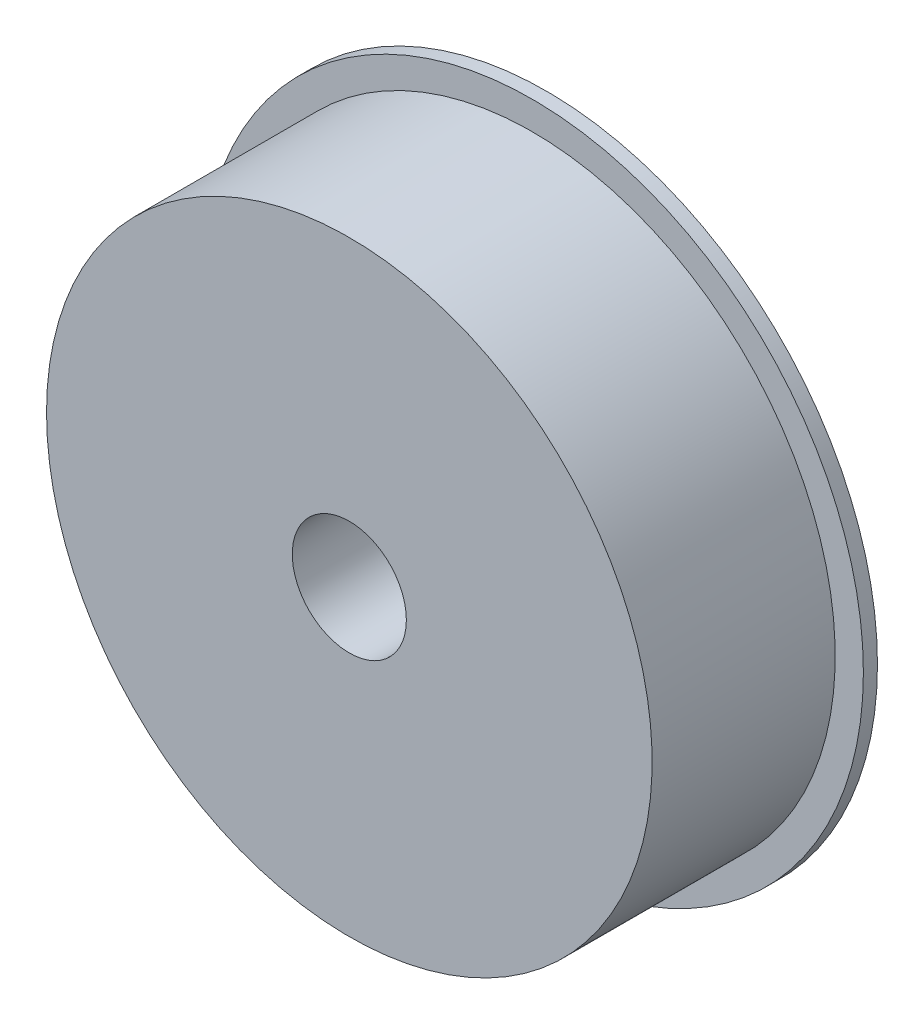
ISO-10303-21;
HEADER;
FILE_DESCRIPTION(('STEP AP214'),'2;1');
FILE_NAME('part.step','',(''),(''),'','','');
FILE_SCHEMA(('AUTOMOTIVE_DESIGN { 1 0 10303 214 1 1 1 1 }'));
ENDSEC;
DATA;
#1=APPLICATION_CONTEXT('core data for automotive mechanical design processes');
#2=APPLICATION_PROTOCOL_DEFINITION('international standard','automotive_design',2000,#1);
#3=PRODUCT_CONTEXT('',#1,'mechanical');
#4=PRODUCT('Part','Part','',(#3));
#5=PRODUCT_RELATED_PRODUCT_CATEGORY('part','',(#4));
#6=PRODUCT_DEFINITION_FORMATION('','',#4);
#7=PRODUCT_DEFINITION_CONTEXT('part definition',#1,'design');
#8=PRODUCT_DEFINITION('design','',#6,#7);
#9=PRODUCT_DEFINITION_SHAPE('','',#8);
#10=(LENGTH_UNIT() NAMED_UNIT(*) SI_UNIT(.MILLI.,.METRE.));
#11=(NAMED_UNIT(*) PLANE_ANGLE_UNIT() SI_UNIT($,.RADIAN.));
#12=(NAMED_UNIT(*) SI_UNIT($,.STERADIAN.) SOLID_ANGLE_UNIT());
#13=UNCERTAINTY_MEASURE_WITH_UNIT(LENGTH_MEASURE(1.E-05),#10,'distance_accuracy_value','');
#14=(GEOMETRIC_REPRESENTATION_CONTEXT(3) GLOBAL_UNCERTAINTY_ASSIGNED_CONTEXT((#13)) GLOBAL_UNIT_ASSIGNED_CONTEXT((#10,
#11,#12)) REPRESENTATION_CONTEXT('',''));
#15=CARTESIAN_POINT('',(0.,0.,0.));
#16=DIRECTION('',(0.,0.,1.));
#17=DIRECTION('',(1.,0.,0.));
#18=AXIS2_PLACEMENT_3D('',#15,#16,#17);
#19=CARTESIAN_POINT('',(0.,0.,0.5));
#20=DIRECTION('',(0.,0.,-1.));
#21=DIRECTION('',(-1.,0.,0.));
#22=AXIS2_PLACEMENT_3D('',#19,#20,#21);
#23=CYLINDRICAL_SURFACE('',#22,23.5);
#24=CARTESIAN_POINT('',(0.,0.,0.5));
#25=DIRECTION('',(0.,0.,1.));
#26=DIRECTION('',(1.,0.,0.));
#27=AXIS2_PLACEMENT_3D('',#24,#25,#26);
#28=CIRCLE('',#27,23.5);
#29=CARTESIAN_POINT('',(23.5,0.,0.5));
#30=VERTEX_POINT('',#29);
#31=EDGE_CURVE('E10',#30,#30,#28,.T.);
#32=ORIENTED_EDGE('',*,*,#31,.F.);
#33=EDGE_LOOP('',(#32));
#34=FACE_BOUND('',#33,.T.);
#35=CARTESIAN_POINT('',(0.,0.,-0.5));
#36=DIRECTION('',(0.,0.,1.));
#37=DIRECTION('',(1.,0.,0.));
#38=AXIS2_PLACEMENT_3D('',#35,#36,#37);
#39=CIRCLE('',#38,23.5);
#40=CARTESIAN_POINT('',(23.5,0.,-0.5));
#41=VERTEX_POINT('',#40);
#42=EDGE_CURVE('E34',#41,#41,#39,.T.);
#43=ORIENTED_EDGE('',*,*,#42,.T.);
#44=EDGE_LOOP('',(#43));
#45=FACE_BOUND('',#44,.T.);
#46=ADVANCED_FACE('F31',(#34,#45),#23,.T.);
#47=CARTESIAN_POINT('',(0.,0.,0.5));
#48=DIRECTION('',(0.,0.,1.));
#49=DIRECTION('',(1.,0.,0.));
#50=AXIS2_PLACEMENT_3D('',#47,#48,#49);
#51=PLANE('',#50);
#52=CARTESIAN_POINT('',(0.,0.,0.5));
#53=DIRECTION('',(0.,0.,1.));
#54=DIRECTION('',(1.,0.,0.));
#55=AXIS2_PLACEMENT_3D('',#52,#53,#54);
#56=CIRCLE('',#55,21.5);
#57=CARTESIAN_POINT('',(-21.5,0.,0.5));
#58=VERTEX_POINT('',#57);
#59=EDGE_CURVE('E43',#58,#58,#56,.T.);
#60=ORIENTED_EDGE('',*,*,#59,.F.);
#61=EDGE_LOOP('',(#60));
#62=FACE_BOUND('',#61,.T.);
#63=ORIENTED_EDGE('',*,*,#31,.T.);
#64=EDGE_LOOP('',(#63));
#65=FACE_BOUND('',#64,.T.);
#66=ADVANCED_FACE('F71',(#62,#65),#51,.T.);
#67=CARTESIAN_POINT('',(0.,0.,-0.5));
#68=DIRECTION('',(0.,0.,1.));
#69=DIRECTION('',(1.,0.,0.));
#70=AXIS2_PLACEMENT_3D('',#67,#68,#69);
#71=PLANE('',#70);
#72=CARTESIAN_POINT('',(0.,0.,-0.5));
#73=DIRECTION('',(0.,0.,1.));
#74=DIRECTION('',(1.,0.,0.));
#75=AXIS2_PLACEMENT_3D('',#72,#73,#74);
#76=CIRCLE('',#75,4.05);
#77=CARTESIAN_POINT('',(4.05,0.,-0.5));
#78=VERTEX_POINT('',#77);
#79=EDGE_CURVE('E46',#78,#78,#76,.T.);
#80=ORIENTED_EDGE('',*,*,#79,.T.);
#81=EDGE_LOOP('',(#80));
#82=FACE_BOUND('',#81,.T.);
#83=ORIENTED_EDGE('',*,*,#42,.F.);
#84=EDGE_LOOP('',(#83));
#85=FACE_BOUND('',#84,.T.);
#86=ADVANCED_FACE('F67',(#82,#85),#71,.F.);
#87=CARTESIAN_POINT('',(0.,0.,13.5));
#88=DIRECTION('',(0.,0.,-1.));
#89=DIRECTION('',(-1.,0.,0.));
#90=AXIS2_PLACEMENT_3D('',#87,#88,#89);
#91=CYLINDRICAL_SURFACE('',#90,21.5);
#92=CARTESIAN_POINT('',(0.,0.,13.5));
#93=DIRECTION('',(0.,0.,1.));
#94=DIRECTION('',(1.,0.,0.));
#95=AXIS2_PLACEMENT_3D('',#92,#93,#94);
#96=CIRCLE('',#95,21.5);
#97=CARTESIAN_POINT('',(-21.5,0.,13.5));
#98=VERTEX_POINT('',#97);
#99=EDGE_CURVE('E41',#98,#98,#96,.T.);
#100=CARTESIAN_POINT('',(-21.5,0.,13.5));
#101=CARTESIAN_POINT('',(-21.5,0.,13.3645833333333));
#102=CARTESIAN_POINT('',(-21.5,0.,13.2291666666667));
#103=CARTESIAN_POINT('',(-21.5,0.,12.9583333333333));
#104=CARTESIAN_POINT('',(-21.5,0.,12.8229166666667));
#105=CARTESIAN_POINT('',(-21.5,0.,12.5520833333333));
#106=CARTESIAN_POINT('',(-21.5,0.,12.4166666666667));
#107=CARTESIAN_POINT('',(-21.5,0.,12.1458333333333));
#108=CARTESIAN_POINT('',(-21.5,0.,12.0104166666667));
#109=CARTESIAN_POINT('',(-21.5,0.,11.7395833333333));
#110=CARTESIAN_POINT('',(-21.5,0.,11.6041666666667));
#111=CARTESIAN_POINT('',(-21.5,0.,11.3333333333333));
#112=CARTESIAN_POINT('',(-21.5,0.,11.1979166666667));
#113=CARTESIAN_POINT('',(-21.5,0.,10.9270833333333));
#114=CARTESIAN_POINT('',(-21.5,0.,10.7916666666667));
#115=CARTESIAN_POINT('',(-21.5,0.,10.5208333333333));
#116=CARTESIAN_POINT('',(-21.5,0.,10.3854166666667));
#117=CARTESIAN_POINT('',(-21.5,0.,10.1145833333333));
#118=CARTESIAN_POINT('',(-21.5,0.,9.97916666666667));
#119=CARTESIAN_POINT('',(-21.5,0.,9.70833333333333));
#120=CARTESIAN_POINT('',(-21.5,0.,9.57291666666667));
#121=CARTESIAN_POINT('',(-21.5,0.,9.30208333333333));
#122=CARTESIAN_POINT('',(-21.5,0.,9.16666666666667));
#123=CARTESIAN_POINT('',(-21.5,0.,8.89583333333333));
#124=CARTESIAN_POINT('',(-21.5,0.,8.76041666666667));
#125=CARTESIAN_POINT('',(-21.5,0.,8.48958333333333));
#126=CARTESIAN_POINT('',(-21.5,0.,8.35416666666667));
#127=CARTESIAN_POINT('',(-21.5,0.,8.08333333333333));
#128=CARTESIAN_POINT('',(-21.5,0.,7.94791666666667));
#129=CARTESIAN_POINT('',(-21.5,0.,7.67708333333333));
#130=CARTESIAN_POINT('',(-21.5,0.,7.54166666666667));
#131=CARTESIAN_POINT('',(-21.5,0.,7.27083333333333));
#132=CARTESIAN_POINT('',(-21.5,0.,7.13541666666667));
#133=CARTESIAN_POINT('',(-21.5,0.,6.86458333333333));
#134=CARTESIAN_POINT('',(-21.5,0.,6.72916666666667));
#135=CARTESIAN_POINT('',(-21.5,0.,6.45833333333333));
#136=CARTESIAN_POINT('',(-21.5,0.,6.32291666666667));
#137=CARTESIAN_POINT('',(-21.5,0.,6.05208333333333));
#138=CARTESIAN_POINT('',(-21.5,0.,5.91666666666667));
#139=CARTESIAN_POINT('',(-21.5,0.,5.64583333333333));
#140=CARTESIAN_POINT('',(-21.5,0.,5.51041666666667));
#141=CARTESIAN_POINT('',(-21.5,0.,5.23958333333333));
#142=CARTESIAN_POINT('',(-21.5,0.,5.10416666666667));
#143=CARTESIAN_POINT('',(-21.5,0.,4.83333333333333));
#144=CARTESIAN_POINT('',(-21.5,0.,4.69791666666667));
#145=CARTESIAN_POINT('',(-21.5,0.,4.42708333333333));
#146=CARTESIAN_POINT('',(-21.5,0.,4.29166666666667));
#147=CARTESIAN_POINT('',(-21.5,0.,4.02083333333333));
#148=CARTESIAN_POINT('',(-21.5,0.,3.88541666666667));
#149=CARTESIAN_POINT('',(-21.5,0.,3.61458333333333));
#150=CARTESIAN_POINT('',(-21.5,0.,3.47916666666667));
#151=CARTESIAN_POINT('',(-21.5,0.,3.20833333333333));
#152=CARTESIAN_POINT('',(-21.5,0.,3.07291666666667));
#153=CARTESIAN_POINT('',(-21.5,0.,2.80208333333333));
#154=CARTESIAN_POINT('',(-21.5,0.,2.66666666666667));
#155=CARTESIAN_POINT('',(-21.5,0.,2.39583333333333));
#156=CARTESIAN_POINT('',(-21.5,0.,2.26041666666667));
#157=CARTESIAN_POINT('',(-21.5,0.,1.98958333333333));
#158=CARTESIAN_POINT('',(-21.5,0.,1.85416666666667));
#159=CARTESIAN_POINT('',(-21.5,0.,1.58333333333333));
#160=CARTESIAN_POINT('',(-21.5,0.,1.44791666666667));
#161=CARTESIAN_POINT('',(-21.5,0.,1.17708333333333));
#162=CARTESIAN_POINT('',(-21.5,0.,1.04166666666667));
#163=CARTESIAN_POINT('',(-21.5,0.,0.770833333333334));
#164=CARTESIAN_POINT('',(-21.5,0.,0.635416666666667));
#165=CARTESIAN_POINT('',(-21.5,0.,0.5));
#166=B_SPLINE_CURVE_WITH_KNOTS('',3,(#100,#101,#102,#103,#104,#105,#106,#107,#108,#109,#110,
#111,#112,#113,#114,#115,#116,#117,#118,#119,#120,#121,#122,#123,#124,#125,#126,#127,#128,#129,
#130,#131,#132,#133,#134,#135,#136,#137,#138,#139,#140,#141,#142,#143,#144,#145,#146,#147,#148,
#149,#150,#151,#152,#153,#154,#155,#156,#157,#158,#159,#160,#161,#162,#163,#164,#165),
.UNSPECIFIED.,.F.,.F.,(4,2,2,2,2,2,2,2,2,2,2,2,2,2,2,2,2,2,2,2,2,2,2,2,2,2,2,2,2,2,2,2,4),(0.,
0.406249999999999,0.812499999999999,1.21875,1.625,2.03125,2.4375,2.84375,3.25,3.65625,4.0625,
4.46875,4.875,5.28125,5.6875,6.09375,6.5,6.90625,7.3125,7.71875,8.125,8.53125,8.9375,9.34375,
9.75,10.15625,10.5625,10.96875,11.375,11.78125,12.1875,12.59375,13.),.UNSPECIFIED.);
#167=EDGE_CURVE('BSEAM61',#98,#58,#166,.T.);
#168=ORIENTED_EDGE('',*,*,#99,.F.);
#169=ORIENTED_EDGE('',*,*,#59,.T.);
#170=ORIENTED_EDGE('',*,*,#167,.T.);
#171=ORIENTED_EDGE('',*,*,#167,.F.);
#172=EDGE_LOOP('',(#168,#170,#169,#171));
#173=FACE_BOUND('',#172,.T.);
#174=ADVANCED_FACE('F61',(#173),#91,.T.);
#175=CARTESIAN_POINT('',(0.,0.,13.5));
#176=DIRECTION('',(0.,0.,1.));
#177=DIRECTION('',(1.,0.,0.));
#178=AXIS2_PLACEMENT_3D('',#175,#176,#177);
#179=PLANE('',#178);
#180=CARTESIAN_POINT('',(0.,0.,13.5));
#181=DIRECTION('',(0.,0.,1.));
#182=DIRECTION('',(1.,0.,0.));
#183=AXIS2_PLACEMENT_3D('',#180,#181,#182);
#184=CIRCLE('',#183,4.05);
#185=CARTESIAN_POINT('',(4.05,0.,13.5));
#186=VERTEX_POINT('',#185);
#187=EDGE_CURVE('E51',#186,#186,#184,.T.);
#188=ORIENTED_EDGE('',*,*,#187,.F.);
#189=EDGE_LOOP('',(#188));
#190=FACE_BOUND('',#189,.T.);
#191=ORIENTED_EDGE('',*,*,#99,.T.);
#192=EDGE_LOOP('',(#191));
#193=FACE_BOUND('',#192,.T.);
#194=ADVANCED_FACE('F58',(#190,#193),#179,.T.);
#195=CARTESIAN_POINT('',(0.,0.,-26.5));
#196=DIRECTION('',(0.,0.,1.));
#197=DIRECTION('',(1.,0.,0.));
#198=AXIS2_PLACEMENT_3D('',#195,#196,#197);
#199=CYLINDRICAL_SURFACE('',#198,4.05);
#200=ORIENTED_EDGE('',*,*,#187,.T.);
#201=EDGE_LOOP('',(#200));
#202=FACE_BOUND('',#201,.T.);
#203=ORIENTED_EDGE('',*,*,#79,.F.);
#204=EDGE_LOOP('',(#203));
#205=FACE_BOUND('',#204,.T.);
#206=ADVANCED_FACE('F55',(#202,#205),#199,.F.);
#207=CLOSED_SHELL('',(#46,#66,#86,#174,#194,#206));
#208=MANIFOLD_SOLID_BREP('B2',#207);
#209=ADVANCED_BREP_SHAPE_REPRESENTATION('',(#18,#208),#14);
#210=SHAPE_DEFINITION_REPRESENTATION(#9,#209);
ENDSEC;
END-ISO-10303-21;
